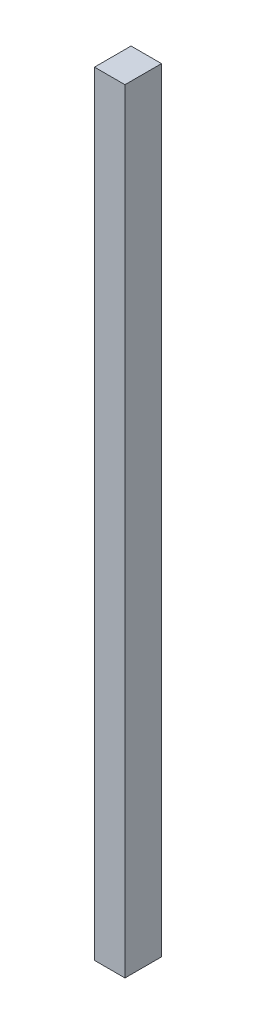
ISO-10303-21;
HEADER;
FILE_DESCRIPTION(('STEP AP214'),'2;1');
FILE_NAME('part.step','',(''),(''),'','','');
FILE_SCHEMA(('AUTOMOTIVE_DESIGN { 1 0 10303 214 1 1 1 1 }'));
ENDSEC;
DATA;
#1=APPLICATION_CONTEXT('core data for automotive mechanical design processes');
#2=APPLICATION_PROTOCOL_DEFINITION('international standard','automotive_design',2000,#1);
#3=PRODUCT_CONTEXT('',#1,'mechanical');
#4=PRODUCT('Part','Part','',(#3));
#5=PRODUCT_RELATED_PRODUCT_CATEGORY('part','',(#4));
#6=PRODUCT_DEFINITION_FORMATION('','',#4);
#7=PRODUCT_DEFINITION_CONTEXT('part definition',#1,'design');
#8=PRODUCT_DEFINITION('design','',#6,#7);
#9=PRODUCT_DEFINITION_SHAPE('','',#8);
#10=(LENGTH_UNIT() NAMED_UNIT(*) SI_UNIT(.MILLI.,.METRE.));
#11=(NAMED_UNIT(*) PLANE_ANGLE_UNIT() SI_UNIT($,.RADIAN.));
#12=(NAMED_UNIT(*) SI_UNIT($,.STERADIAN.) SOLID_ANGLE_UNIT());
#13=UNCERTAINTY_MEASURE_WITH_UNIT(LENGTH_MEASURE(1.E-05),#10,'distance_accuracy_value','');
#14=(GEOMETRIC_REPRESENTATION_CONTEXT(3) GLOBAL_UNCERTAINTY_ASSIGNED_CONTEXT((#13)) GLOBAL_UNIT_ASSIGNED_CONTEXT((#10,
#11,#12)) REPRESENTATION_CONTEXT('',''));
#15=CARTESIAN_POINT('',(0.,0.,0.));
#16=DIRECTION('',(0.,0.,1.));
#17=DIRECTION('',(1.,0.,0.));
#18=AXIS2_PLACEMENT_3D('',#15,#16,#17);
#19=CARTESIAN_POINT('',(2.5,127.,3.));
#20=DIRECTION('',(-1.,0.,0.));
#21=DIRECTION('',(0.,0.,1.));
#22=AXIS2_PLACEMENT_3D('',#19,#20,#21);
#23=PLANE('',#22);
#24=DIRECTION('',(0.,0.,-1.));
#25=VECTOR('',#24,1.);
#26=CARTESIAN_POINT('',(2.5,0.,3.));
#27=LINE('',#26,#25);
#28=CARTESIAN_POINT('',(2.5,0.,3.));
#29=VERTEX_POINT('',#28);
#30=CARTESIAN_POINT('',(2.5,0.,-3.));
#31=VERTEX_POINT('',#30);
#32=EDGE_CURVE('E111',#29,#31,#27,.T.);
#33=ORIENTED_EDGE('',*,*,#32,.T.);
#34=DIRECTION('',(0.,-1.,0.));
#35=VECTOR('',#34,1.);
#36=CARTESIAN_POINT('',(2.5,127.,-3.));
#37=LINE('',#36,#35);
#38=CARTESIAN_POINT('',(2.5,127.,-3.));
#39=VERTEX_POINT('',#38);
#40=EDGE_CURVE('E11',#39,#31,#37,.T.);
#41=ORIENTED_EDGE('',*,*,#40,.F.);
#42=DIRECTION('',(0.,0.,-1.));
#43=VECTOR('',#42,1.);
#44=CARTESIAN_POINT('',(2.5,127.,3.));
#45=LINE('',#44,#43);
#46=CARTESIAN_POINT('',(2.5,127.,3.));
#47=VERTEX_POINT('',#46);
#48=EDGE_CURVE('E95',#47,#39,#45,.T.);
#49=ORIENTED_EDGE('',*,*,#48,.F.);
#50=DIRECTION('',(0.,-1.,0.));
#51=VECTOR('',#50,1.);
#52=CARTESIAN_POINT('',(2.5,127.,3.));
#53=LINE('',#52,#51);
#54=EDGE_CURVE('E107',#47,#29,#53,.T.);
#55=ORIENTED_EDGE('',*,*,#54,.T.);
#56=EDGE_LOOP('',(#33,#41,#49,#55));
#57=FACE_BOUND('',#56,.T.);
#58=ADVANCED_FACE('F43',(#57),#23,.F.);
#59=CARTESIAN_POINT('',(-2.5,127.,-3.));
#60=DIRECTION('',(0.,0.,1.));
#61=DIRECTION('',(1.,0.,0.));
#62=AXIS2_PLACEMENT_3D('',#59,#60,#61);
#63=PLANE('',#62);
#64=DIRECTION('',(-1.,0.,0.));
#65=VECTOR('',#64,1.);
#66=CARTESIAN_POINT('',(-2.5,0.,-3.));
#67=LINE('',#66,#65);
#68=CARTESIAN_POINT('',(-2.5,0.,-3.));
#69=VERTEX_POINT('',#68);
#70=EDGE_CURVE('E100',#31,#69,#67,.T.);
#71=ORIENTED_EDGE('',*,*,#70,.T.);
#72=DIRECTION('',(0.,-1.,0.));
#73=VECTOR('',#72,1.);
#74=CARTESIAN_POINT('',(-2.5,127.,-3.));
#75=LINE('',#74,#73);
#76=CARTESIAN_POINT('',(-2.5,127.,-3.));
#77=VERTEX_POINT('',#76);
#78=EDGE_CURVE('E52',#77,#69,#75,.T.);
#79=ORIENTED_EDGE('',*,*,#78,.F.);
#80=DIRECTION('',(-1.,0.,0.));
#81=VECTOR('',#80,1.);
#82=CARTESIAN_POINT('',(-2.5,127.,-3.));
#83=LINE('',#82,#81);
#84=EDGE_CURVE('E90',#39,#77,#83,.T.);
#85=ORIENTED_EDGE('',*,*,#84,.F.);
#86=ORIENTED_EDGE('',*,*,#40,.T.);
#87=EDGE_LOOP('',(#71,#79,#85,#86));
#88=FACE_BOUND('',#87,.T.);
#89=ADVANCED_FACE('F99',(#88),#63,.F.);
#90=CARTESIAN_POINT('',(-2.5,127.,3.));
#91=DIRECTION('',(1.,0.,0.));
#92=DIRECTION('',(0.,0.,-1.));
#93=AXIS2_PLACEMENT_3D('',#90,#91,#92);
#94=PLANE('',#93);
#95=DIRECTION('',(0.,0.,1.));
#96=VECTOR('',#95,1.);
#97=CARTESIAN_POINT('',(-2.5,0.,3.));
#98=LINE('',#97,#96);
#99=CARTESIAN_POINT('',(-2.5,0.,3.));
#100=VERTEX_POINT('',#99);
#101=EDGE_CURVE('E77',#69,#100,#98,.T.);
#102=ORIENTED_EDGE('',*,*,#101,.T.);
#103=DIRECTION('',(0.,-1.,0.));
#104=VECTOR('',#103,1.);
#105=CARTESIAN_POINT('',(-2.5,127.,3.));
#106=LINE('',#105,#104);
#107=CARTESIAN_POINT('',(-2.5,127.,3.));
#108=VERTEX_POINT('',#107);
#109=EDGE_CURVE('E102',#108,#100,#106,.T.);
#110=ORIENTED_EDGE('',*,*,#109,.F.);
#111=DIRECTION('',(0.,0.,1.));
#112=VECTOR('',#111,1.);
#113=CARTESIAN_POINT('',(-2.5,127.,3.));
#114=LINE('',#113,#112);
#115=EDGE_CURVE('E93',#77,#108,#114,.T.);
#116=ORIENTED_EDGE('',*,*,#115,.F.);
#117=ORIENTED_EDGE('',*,*,#78,.T.);
#118=EDGE_LOOP('',(#102,#110,#116,#117));
#119=FACE_BOUND('',#118,.T.);
#120=ADVANCED_FACE('F103',(#119),#94,.F.);
#121=CARTESIAN_POINT('',(-2.5,127.,3.));
#122=DIRECTION('',(0.,0.,-1.));
#123=DIRECTION('',(-1.,0.,0.));
#124=AXIS2_PLACEMENT_3D('',#121,#122,#123);
#125=PLANE('',#124);
#126=DIRECTION('',(1.,0.,0.));
#127=VECTOR('',#126,1.);
#128=CARTESIAN_POINT('',(-2.5,0.,3.));
#129=LINE('',#128,#127);
#130=EDGE_CURVE('E83',#100,#29,#129,.T.);
#131=ORIENTED_EDGE('',*,*,#130,.T.);
#132=ORIENTED_EDGE('',*,*,#54,.F.);
#133=DIRECTION('',(1.,0.,0.));
#134=VECTOR('',#133,1.);
#135=CARTESIAN_POINT('',(-2.5,127.,3.));
#136=LINE('',#135,#134);
#137=EDGE_CURVE('E60',#108,#47,#136,.T.);
#138=ORIENTED_EDGE('',*,*,#137,.F.);
#139=ORIENTED_EDGE('',*,*,#109,.T.);
#140=EDGE_LOOP('',(#131,#132,#138,#139));
#141=FACE_BOUND('',#140,.T.);
#142=ADVANCED_FACE('F124',(#141),#125,.F.);
#143=CARTESIAN_POINT('',(0.,127.,0.));
#144=DIRECTION('',(0.,-1.,0.));
#145=DIRECTION('',(0.,0.,-1.));
#146=AXIS2_PLACEMENT_3D('',#143,#144,#145);
#147=PLANE('',#146);
#148=ORIENTED_EDGE('',*,*,#48,.T.);
#149=ORIENTED_EDGE('',*,*,#84,.T.);
#150=ORIENTED_EDGE('',*,*,#115,.T.);
#151=ORIENTED_EDGE('',*,*,#137,.T.);
#152=EDGE_LOOP('',(#148,#149,#150,#151));
#153=FACE_BOUND('',#152,.T.);
#154=ADVANCED_FACE('F91',(#153),#147,.F.);
#155=CARTESIAN_POINT('',(0.,0.,0.));
#156=DIRECTION('',(0.,-1.,0.));
#157=DIRECTION('',(0.,0.,-1.));
#158=AXIS2_PLACEMENT_3D('',#155,#156,#157);
#159=PLANE('',#158);
#160=ORIENTED_EDGE('',*,*,#32,.F.);
#161=ORIENTED_EDGE('',*,*,#130,.F.);
#162=ORIENTED_EDGE('',*,*,#101,.F.);
#163=ORIENTED_EDGE('',*,*,#70,.F.);
#164=EDGE_LOOP('',(#160,#161,#162,#163));
#165=FACE_BOUND('',#164,.T.);
#166=ADVANCED_FACE('F127',(#165),#159,.T.);
#167=CLOSED_SHELL('',(#58,#89,#120,#142,#154,#166));
#168=MANIFOLD_SOLID_BREP('B2',#167);
#169=ADVANCED_BREP_SHAPE_REPRESENTATION('',(#18,#168),#14);
#170=SHAPE_DEFINITION_REPRESENTATION(#9,#169);
ENDSEC;
END-ISO-10303-21;
